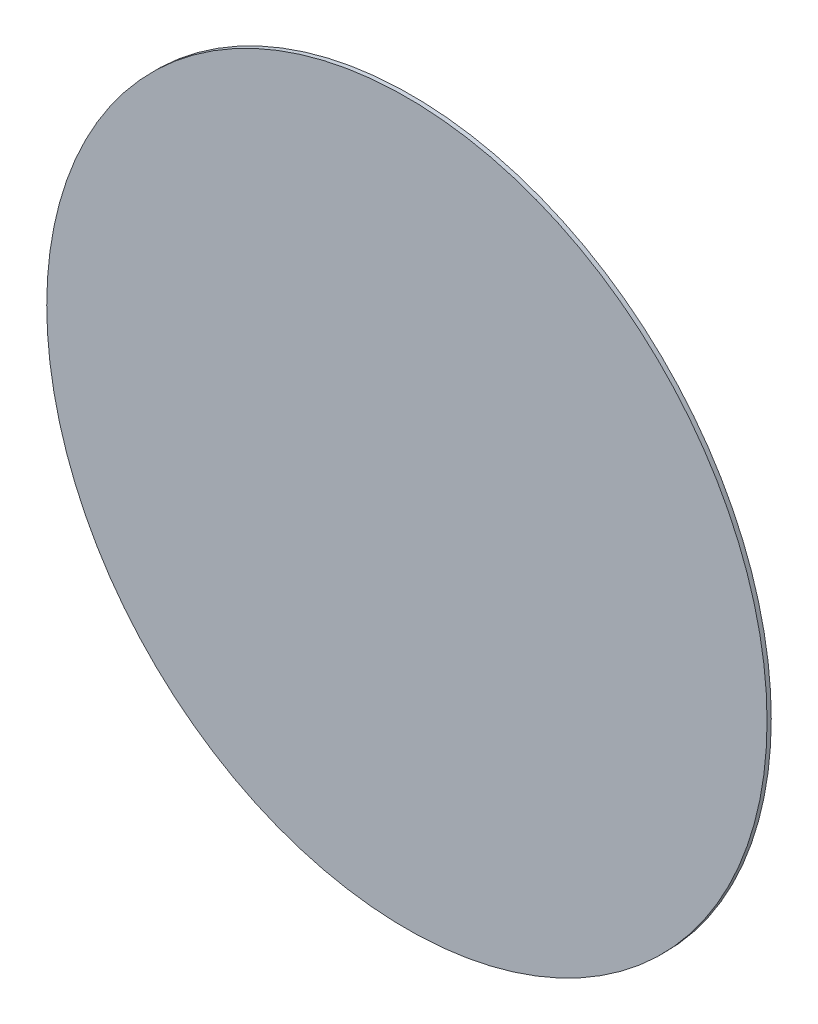
ISO-10303-21;
HEADER;
FILE_DESCRIPTION(('STEP AP214'),'2;1');
FILE_NAME('part.step','',(''),(''),'','','');
FILE_SCHEMA(('AUTOMOTIVE_DESIGN { 1 0 10303 214 1 1 1 1 }'));
ENDSEC;
DATA;
#1=APPLICATION_CONTEXT('core data for automotive mechanical design processes');
#2=APPLICATION_PROTOCOL_DEFINITION('international standard','automotive_design',2000,#1);
#3=PRODUCT_CONTEXT('',#1,'mechanical');
#4=PRODUCT('Part','Part','',(#3));
#5=PRODUCT_RELATED_PRODUCT_CATEGORY('part','',(#4));
#6=PRODUCT_DEFINITION_FORMATION('','',#4);
#7=PRODUCT_DEFINITION_CONTEXT('part definition',#1,'design');
#8=PRODUCT_DEFINITION('design','',#6,#7);
#9=PRODUCT_DEFINITION_SHAPE('','',#8);
#10=(LENGTH_UNIT() NAMED_UNIT(*) SI_UNIT(.MILLI.,.METRE.));
#11=(NAMED_UNIT(*) PLANE_ANGLE_UNIT() SI_UNIT($,.RADIAN.));
#12=(NAMED_UNIT(*) SI_UNIT($,.STERADIAN.) SOLID_ANGLE_UNIT());
#13=UNCERTAINTY_MEASURE_WITH_UNIT(LENGTH_MEASURE(1.E-05),#10,'distance_accuracy_value','');
#14=(GEOMETRIC_REPRESENTATION_CONTEXT(3) GLOBAL_UNCERTAINTY_ASSIGNED_CONTEXT((#13)) GLOBAL_UNIT_ASSIGNED_CONTEXT((#10,
#11,#12)) REPRESENTATION_CONTEXT('',''));
#15=CARTESIAN_POINT('',(0.,0.,0.));
#16=DIRECTION('',(0.,0.,1.));
#17=DIRECTION('',(1.,0.,0.));
#18=AXIS2_PLACEMENT_3D('',#15,#16,#17);
#19=CARTESIAN_POINT('',(0.,0.,0.1778));
#20=DIRECTION('',(0.,0.,-1.));
#21=DIRECTION('',(-1.,0.,0.));
#22=AXIS2_PLACEMENT_3D('',#19,#20,#21);
#23=CYLINDRICAL_SURFACE('',#22,15.24);
#24=CARTESIAN_POINT('',(0.,0.,0.1778));
#25=DIRECTION('',(0.,0.,1.));
#26=DIRECTION('',(1.,0.,0.));
#27=AXIS2_PLACEMENT_3D('',#24,#25,#26);
#28=CIRCLE('',#27,15.24);
#29=CARTESIAN_POINT('',(15.24,0.,0.1778));
#30=VERTEX_POINT('',#29);
#31=EDGE_CURVE('E10',#30,#30,#28,.T.);
#32=ORIENTED_EDGE('',*,*,#31,.F.);
#33=EDGE_LOOP('',(#32));
#34=FACE_BOUND('',#33,.T.);
#35=CARTESIAN_POINT('',(0.,0.,0.));
#36=DIRECTION('',(0.,0.,1.));
#37=DIRECTION('',(1.,0.,0.));
#38=AXIS2_PLACEMENT_3D('',#35,#36,#37);
#39=CIRCLE('',#38,15.24);
#40=CARTESIAN_POINT('',(15.24,0.,0.));
#41=VERTEX_POINT('',#40);
#42=EDGE_CURVE('E34',#41,#41,#39,.T.);
#43=ORIENTED_EDGE('',*,*,#42,.T.);
#44=EDGE_LOOP('',(#43));
#45=FACE_BOUND('',#44,.T.);
#46=ADVANCED_FACE('F31',(#34,#45),#23,.T.);
#47=CARTESIAN_POINT('',(0.,0.,0.1778));
#48=DIRECTION('',(0.,0.,1.));
#49=DIRECTION('',(1.,0.,0.));
#50=AXIS2_PLACEMENT_3D('',#47,#48,#49);
#51=PLANE('',#50);
#52=ORIENTED_EDGE('',*,*,#31,.T.);
#53=EDGE_LOOP('',(#52));
#54=FACE_BOUND('',#53,.T.);
#55=ADVANCED_FACE('F46',(#54),#51,.T.);
#56=CARTESIAN_POINT('',(0.,0.,0.));
#57=DIRECTION('',(0.,0.,1.));
#58=DIRECTION('',(1.,0.,0.));
#59=AXIS2_PLACEMENT_3D('',#56,#57,#58);
#60=PLANE('',#59);
#61=ORIENTED_EDGE('',*,*,#42,.F.);
#62=EDGE_LOOP('',(#61));
#63=FACE_BOUND('',#62,.T.);
#64=ADVANCED_FACE('F44',(#63),#60,.F.);
#65=CLOSED_SHELL('',(#46,#55,#64));
#66=MANIFOLD_SOLID_BREP('B2',#65);
#67=ADVANCED_BREP_SHAPE_REPRESENTATION('',(#18,#66),#14);
#68=SHAPE_DEFINITION_REPRESENTATION(#9,#67);
ENDSEC;
END-ISO-10303-21;
